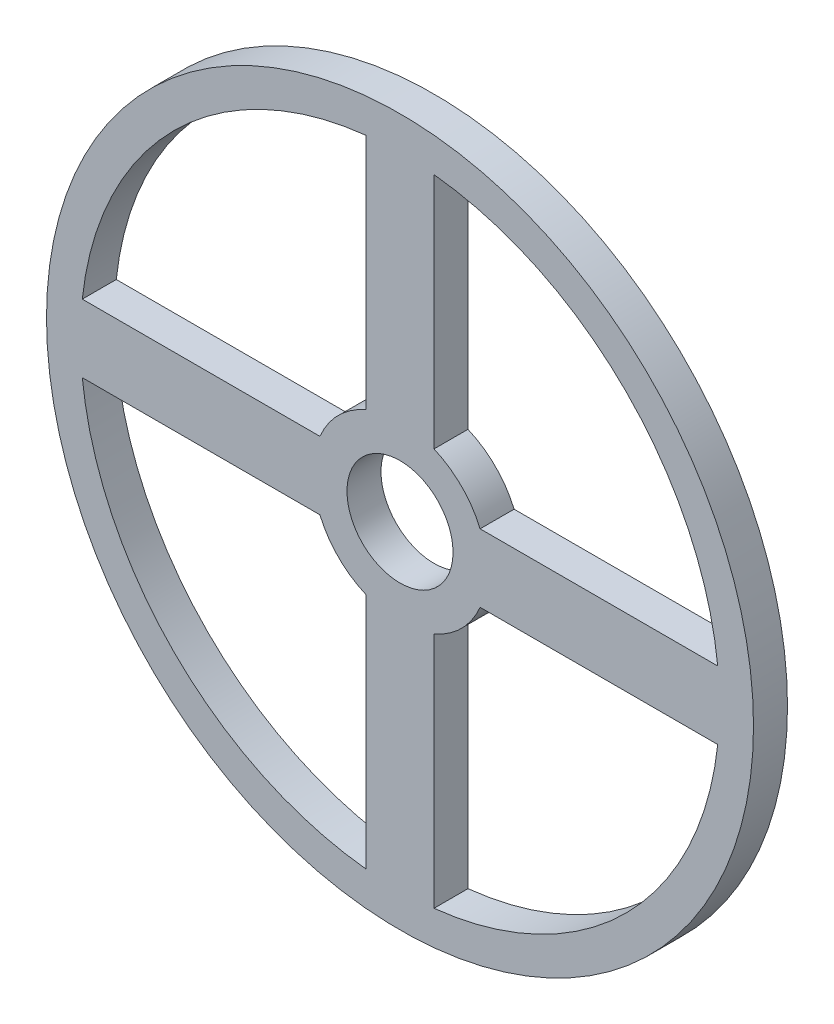
ISO-10303-21;
HEADER;
FILE_DESCRIPTION(('STEP AP214'),'2;1');
FILE_NAME('part.step','',(''),(''),'','','');
FILE_SCHEMA(('AUTOMOTIVE_DESIGN { 1 0 10303 214 1 1 1 1 }'));
ENDSEC;
DATA;
#1=APPLICATION_CONTEXT('core data for automotive mechanical design processes');
#2=APPLICATION_PROTOCOL_DEFINITION('international standard','automotive_design',2000,#1);
#3=PRODUCT_CONTEXT('',#1,'mechanical');
#4=PRODUCT('Part','Part','',(#3));
#5=PRODUCT_RELATED_PRODUCT_CATEGORY('part','',(#4));
#6=PRODUCT_DEFINITION_FORMATION('','',#4);
#7=PRODUCT_DEFINITION_CONTEXT('part definition',#1,'design');
#8=PRODUCT_DEFINITION('design','',#6,#7);
#9=PRODUCT_DEFINITION_SHAPE('','',#8);
#10=(LENGTH_UNIT() NAMED_UNIT(*) SI_UNIT(.MILLI.,.METRE.));
#11=(NAMED_UNIT(*) PLANE_ANGLE_UNIT() SI_UNIT($,.RADIAN.));
#12=(NAMED_UNIT(*) SI_UNIT($,.STERADIAN.) SOLID_ANGLE_UNIT());
#13=UNCERTAINTY_MEASURE_WITH_UNIT(LENGTH_MEASURE(1.E-05),#10,'distance_accuracy_value','');
#14=(GEOMETRIC_REPRESENTATION_CONTEXT(3) GLOBAL_UNCERTAINTY_ASSIGNED_CONTEXT((#13)) GLOBAL_UNIT_ASSIGNED_CONTEXT((#10,
#11,#12)) REPRESENTATION_CONTEXT('',''));
#15=CARTESIAN_POINT('',(0.,0.,0.));
#16=DIRECTION('',(0.,0.,1.));
#17=DIRECTION('',(1.,0.,0.));
#18=AXIS2_PLACEMENT_3D('',#15,#16,#17);
#19=CARTESIAN_POINT('',(0.,0.,3.175));
#20=DIRECTION('',(0.,0.,1.));
#21=DIRECTION('',(1.,0.,0.));
#22=AXIS2_PLACEMENT_3D('',#19,#20,#21);
#23=PLANE('',#22);
#24=DIRECTION('',(0.,1.,0.));
#25=VECTOR('',#24,1.);
#26=CARTESIAN_POINT('',(-3.175,7.48222954740095,3.175));
#27=LINE('',#26,#25);
#28=CARTESIAN_POINT('',(-3.175,7.48222954740095,3.175));
#29=VERTEX_POINT('',#28);
#30=CARTESIAN_POINT('',(-3.175,29.6756364716917,3.175));
#31=VERTEX_POINT('',#30);
#32=EDGE_CURVE('E253',#29,#31,#27,.T.);
#33=ORIENTED_EDGE('',*,*,#32,.F.);
#34=CARTESIAN_POINT('',(0.,0.,3.175));
#35=DIRECTION('',(0.,0.,-1.));
#36=DIRECTION('',(-1.,0.,0.));
#37=AXIS2_PLACEMENT_3D('',#34,#35,#36);
#38=CIRCLE('',#37,8.12800000000004);
#39=CARTESIAN_POINT('',(-7.48222954740095,3.175,3.175));
#40=VERTEX_POINT('',#39);
#41=EDGE_CURVE('E251',#40,#29,#38,.T.);
#42=ORIENTED_EDGE('',*,*,#41,.F.);
#43=DIRECTION('',(1.,0.,0.));
#44=VECTOR('',#43,1.);
#45=CARTESIAN_POINT('',(-7.48222954740095,3.175,3.175));
#46=LINE('',#45,#44);
#47=CARTESIAN_POINT('',(-29.6756364716917,3.175,3.175));
#48=VERTEX_POINT('',#47);
#49=EDGE_CURVE('E259',#48,#40,#46,.T.);
#50=ORIENTED_EDGE('',*,*,#49,.F.);
#51=CARTESIAN_POINT('',(0.,0.,3.175));
#52=DIRECTION('',(0.,0.,1.));
#53=DIRECTION('',(-1.,0.,0.));
#54=AXIS2_PLACEMENT_3D('',#51,#52,#53);
#55=CIRCLE('',#54,29.845);
#56=EDGE_CURVE('E256',#31,#48,#55,.T.);
#57=ORIENTED_EDGE('',*,*,#56,.F.);
#58=EDGE_LOOP('',(#33,#42,#50,#57));
#59=FACE_BOUND('',#58,.T.);
#60=CARTESIAN_POINT('',(0.,0.,3.175));
#61=DIRECTION('',(0.,0.,1.));
#62=DIRECTION('',(1.,0.,0.));
#63=AXIS2_PLACEMENT_3D('',#60,#61,#62);
#64=CIRCLE('',#63,33.02);
#65=CARTESIAN_POINT('',(33.02,0.,3.175));
#66=VERTEX_POINT('',#65);
#67=EDGE_CURVE('E11',#66,#66,#64,.T.);
#68=ORIENTED_EDGE('',*,*,#67,.T.);
#69=EDGE_LOOP('',(#68));
#70=FACE_BOUND('',#69,.T.);
#71=CARTESIAN_POINT('',(0.,0.,3.175));
#72=DIRECTION('',(0.,0.,1.));
#73=DIRECTION('',(1.,0.,0.));
#74=AXIS2_PLACEMENT_3D('',#71,#72,#73);
#75=CIRCLE('',#74,4.953);
#76=CARTESIAN_POINT('',(4.953,0.,3.175));
#77=VERTEX_POINT('',#76);
#78=EDGE_CURVE('E245',#77,#77,#75,.T.);
#79=ORIENTED_EDGE('',*,*,#78,.F.);
#80=EDGE_LOOP('',(#79));
#81=FACE_BOUND('',#80,.T.);
#82=DIRECTION('',(1.,0.,0.));
#83=VECTOR('',#82,1.);
#84=CARTESIAN_POINT('',(7.48222954740096,3.17499999999997,3.175));
#85=LINE('',#84,#83);
#86=CARTESIAN_POINT('',(7.48222954740096,3.17499999999997,3.175));
#87=VERTEX_POINT('',#86);
#88=CARTESIAN_POINT('',(29.6756364716917,3.17499999999989,3.175));
#89=VERTEX_POINT('',#88);
#90=EDGE_CURVE('E216',#87,#89,#85,.T.);
#91=ORIENTED_EDGE('',*,*,#90,.F.);
#92=CARTESIAN_POINT('',(0.,0.,3.175));
#93=DIRECTION('',(0.,0.,-1.));
#94=DIRECTION('',(-1.,0.,0.));
#95=AXIS2_PLACEMENT_3D('',#92,#93,#94);
#96=CIRCLE('',#95,8.12799999999999);
#97=CARTESIAN_POINT('',(3.17500000000003,7.48222954740094,3.175));
#98=VERTEX_POINT('',#97);
#99=EDGE_CURVE('E214',#98,#87,#96,.T.);
#100=ORIENTED_EDGE('',*,*,#99,.F.);
#101=DIRECTION('',(0.,-1.,0.));
#102=VECTOR('',#101,1.);
#103=CARTESIAN_POINT('',(3.17500000000003,7.48222954740094,3.175));
#104=LINE('',#103,#102);
#105=CARTESIAN_POINT('',(3.1750000000001,29.6756364716917,3.175));
#106=VERTEX_POINT('',#105);
#107=EDGE_CURVE('E222',#106,#98,#104,.T.);
#108=ORIENTED_EDGE('',*,*,#107,.F.);
#109=CARTESIAN_POINT('',(0.,0.,3.175));
#110=DIRECTION('',(0.,0.,1.));
#111=DIRECTION('',(-1.,0.,0.));
#112=AXIS2_PLACEMENT_3D('',#109,#110,#111);
#113=CIRCLE('',#112,29.845);
#114=EDGE_CURVE('E219',#89,#106,#113,.T.);
#115=ORIENTED_EDGE('',*,*,#114,.F.);
#116=EDGE_LOOP('',(#91,#100,#108,#115));
#117=FACE_BOUND('',#116,.T.);
#118=DIRECTION('',(0.,-1.,0.));
#119=VECTOR('',#118,1.);
#120=CARTESIAN_POINT('',(3.17499999999995,-7.48222954740097,3.175));
#121=LINE('',#120,#119);
#122=CARTESIAN_POINT('',(3.17499999999995,-7.48222954740097,3.175));
#123=VERTEX_POINT('',#122);
#124=CARTESIAN_POINT('',(3.1749999999998,-29.6756364716917,3.175));
#125=VERTEX_POINT('',#124);
#126=EDGE_CURVE('E185',#123,#125,#121,.T.);
#127=ORIENTED_EDGE('',*,*,#126,.F.);
#128=CARTESIAN_POINT('',(0.,0.,3.175));
#129=DIRECTION('',(0.,0.,-1.));
#130=DIRECTION('',(-1.,0.,0.));
#131=AXIS2_PLACEMENT_3D('',#128,#129,#130);
#132=CIRCLE('',#131,8.12799999999993);
#133=CARTESIAN_POINT('',(7.48222954740093,-3.17500000000005,3.175));
#134=VERTEX_POINT('',#133);
#135=EDGE_CURVE('E183',#134,#123,#132,.T.);
#136=ORIENTED_EDGE('',*,*,#135,.F.);
#137=DIRECTION('',(-1.,0.,0.));
#138=VECTOR('',#137,1.);
#139=CARTESIAN_POINT('',(7.48222954740093,-3.17500000000005,3.175));
#140=LINE('',#139,#138);
#141=CARTESIAN_POINT('',(29.6756364716917,-3.17500000000021,3.175));
#142=VERTEX_POINT('',#141);
#143=EDGE_CURVE('E191',#142,#134,#140,.T.);
#144=ORIENTED_EDGE('',*,*,#143,.F.);
#145=CARTESIAN_POINT('',(0.,0.,3.175));
#146=DIRECTION('',(0.,0.,1.));
#147=DIRECTION('',(-1.,0.,0.));
#148=AXIS2_PLACEMENT_3D('',#145,#146,#147);
#149=CIRCLE('',#148,29.845);
#150=EDGE_CURVE('E188',#125,#142,#149,.T.);
#151=ORIENTED_EDGE('',*,*,#150,.F.);
#152=EDGE_LOOP('',(#127,#136,#144,#151));
#153=FACE_BOUND('',#152,.T.);
#154=DIRECTION('',(-1.,0.,0.));
#155=VECTOR('',#154,1.);
#156=CARTESIAN_POINT('',(-7.48222954740098,-3.17499999999992,3.175));
#157=LINE('',#156,#155);
#158=CARTESIAN_POINT('',(-7.48222954740098,-3.17499999999992,3.175));
#159=VERTEX_POINT('',#158);
#160=CARTESIAN_POINT('',(-29.6756364716918,-3.17499999999969,3.175));
#161=VERTEX_POINT('',#160);
#162=EDGE_CURVE('E155',#159,#161,#157,.T.);
#163=ORIENTED_EDGE('',*,*,#162,.F.);
#164=CARTESIAN_POINT('',(0.,0.,3.175));
#165=DIRECTION('',(0.,0.,-1.));
#166=DIRECTION('',(-1.,0.,0.));
#167=AXIS2_PLACEMENT_3D('',#164,#165,#166);
#168=CIRCLE('',#167,8.12799999999999);
#169=CARTESIAN_POINT('',(-3.17500000000008,-7.48222954740092,3.175));
#170=VERTEX_POINT('',#169);
#171=EDGE_CURVE('E147',#170,#159,#168,.T.);
#172=ORIENTED_EDGE('',*,*,#171,.F.);
#173=DIRECTION('',(0.,1.,0.));
#174=VECTOR('',#173,1.);
#175=CARTESIAN_POINT('',(-3.17500000000008,-7.48222954740092,3.175));
#176=LINE('',#175,#174);
#177=CARTESIAN_POINT('',(-3.17500000000031,-29.6756364716917,3.175));
#178=VERTEX_POINT('',#177);
#179=EDGE_CURVE('E169',#178,#170,#176,.T.);
#180=ORIENTED_EDGE('',*,*,#179,.F.);
#181=CARTESIAN_POINT('',(0.,0.,3.175));
#182=DIRECTION('',(0.,0.,1.));
#183=DIRECTION('',(-1.,0.,0.));
#184=AXIS2_PLACEMENT_3D('',#181,#182,#183);
#185=CIRCLE('',#184,29.845);
#186=EDGE_CURVE('E167',#161,#178,#185,.T.);
#187=ORIENTED_EDGE('',*,*,#186,.F.);
#188=EDGE_LOOP('',(#163,#172,#180,#187));
#189=FACE_BOUND('',#188,.T.);
#190=ADVANCED_FACE('F34',(#59,#70,#81,#117,#153,#189),#23,.T.);
#191=CARTESIAN_POINT('',(0.,0.,0.));
#192=DIRECTION('',(0.,0.,1.));
#193=DIRECTION('',(1.,0.,0.));
#194=AXIS2_PLACEMENT_3D('',#191,#192,#193);
#195=PLANE('',#194);
#196=CARTESIAN_POINT('',(0.,0.,0.));
#197=DIRECTION('',(0.,0.,-1.));
#198=DIRECTION('',(-1.,0.,0.));
#199=AXIS2_PLACEMENT_3D('',#196,#197,#198);
#200=CIRCLE('',#199,8.12799999999993);
#201=CARTESIAN_POINT('',(7.48222954740093,-3.17500000000005,0.));
#202=VERTEX_POINT('',#201);
#203=CARTESIAN_POINT('',(3.17499999999995,-7.48222954740097,0.));
#204=VERTEX_POINT('',#203);
#205=EDGE_CURVE('E163',#202,#204,#200,.T.);
#206=ORIENTED_EDGE('',*,*,#205,.T.);
#207=DIRECTION('',(0.,-1.,0.));
#208=VECTOR('',#207,1.);
#209=CARTESIAN_POINT('',(3.17499999999995,-7.48222954740097,0.));
#210=LINE('',#209,#208);
#211=CARTESIAN_POINT('',(3.1749999999998,-29.6756364716917,0.));
#212=VERTEX_POINT('',#211);
#213=EDGE_CURVE('E196',#204,#212,#210,.T.);
#214=ORIENTED_EDGE('',*,*,#213,.T.);
#215=CARTESIAN_POINT('',(0.,0.,0.));
#216=DIRECTION('',(0.,0.,1.));
#217=DIRECTION('',(-1.,0.,0.));
#218=AXIS2_PLACEMENT_3D('',#215,#216,#217);
#219=CIRCLE('',#218,29.845);
#220=CARTESIAN_POINT('',(29.6756364716917,-3.17500000000021,0.));
#221=VERTEX_POINT('',#220);
#222=EDGE_CURVE('E199',#212,#221,#219,.T.);
#223=ORIENTED_EDGE('',*,*,#222,.T.);
#224=DIRECTION('',(-1.,0.,0.));
#225=VECTOR('',#224,1.);
#226=CARTESIAN_POINT('',(7.48222954740093,-3.17500000000005,0.));
#227=LINE('',#226,#225);
#228=EDGE_CURVE('E186',#221,#202,#227,.T.);
#229=ORIENTED_EDGE('',*,*,#228,.T.);
#230=EDGE_LOOP('',(#206,#214,#223,#229));
#231=FACE_BOUND('',#230,.T.);
#232=CARTESIAN_POINT('',(0.,0.,0.));
#233=DIRECTION('',(0.,0.,1.));
#234=DIRECTION('',(1.,0.,0.));
#235=AXIS2_PLACEMENT_3D('',#232,#233,#234);
#236=CIRCLE('',#235,4.953);
#237=CARTESIAN_POINT('',(4.953,0.,0.));
#238=VERTEX_POINT('',#237);
#239=EDGE_CURVE('E244',#238,#238,#236,.T.);
#240=ORIENTED_EDGE('',*,*,#239,.T.);
#241=EDGE_LOOP('',(#240));
#242=FACE_BOUND('',#241,.T.);
#243=CARTESIAN_POINT('',(0.,0.,0.));
#244=DIRECTION('',(0.,0.,-1.));
#245=DIRECTION('',(-1.,0.,0.));
#246=AXIS2_PLACEMENT_3D('',#243,#244,#245);
#247=CIRCLE('',#246,8.12800000000004);
#248=CARTESIAN_POINT('',(-7.48222954740095,3.175,0.));
#249=VERTEX_POINT('',#248);
#250=CARTESIAN_POINT('',(-3.175,7.48222954740095,0.));
#251=VERTEX_POINT('',#250);
#252=EDGE_CURVE('E248',#249,#251,#247,.T.);
#253=ORIENTED_EDGE('',*,*,#252,.T.);
#254=DIRECTION('',(0.,1.,0.));
#255=VECTOR('',#254,1.);
#256=CARTESIAN_POINT('',(-3.175,7.48222954740095,0.));
#257=LINE('',#256,#255);
#258=CARTESIAN_POINT('',(-3.175,29.6756364716917,0.));
#259=VERTEX_POINT('',#258);
#260=EDGE_CURVE('E264',#251,#259,#257,.T.);
#261=ORIENTED_EDGE('',*,*,#260,.T.);
#262=CARTESIAN_POINT('',(0.,0.,0.));
#263=DIRECTION('',(0.,0.,1.));
#264=DIRECTION('',(-1.,0.,0.));
#265=AXIS2_PLACEMENT_3D('',#262,#263,#264);
#266=CIRCLE('',#265,29.845);
#267=CARTESIAN_POINT('',(-29.6756364716917,3.175,0.));
#268=VERTEX_POINT('',#267);
#269=EDGE_CURVE('E267',#259,#268,#266,.T.);
#270=ORIENTED_EDGE('',*,*,#269,.T.);
#271=DIRECTION('',(1.,0.,0.));
#272=VECTOR('',#271,1.);
#273=CARTESIAN_POINT('',(-7.48222954740095,3.175,0.));
#274=LINE('',#273,#272);
#275=EDGE_CURVE('E254',#268,#249,#274,.T.);
#276=ORIENTED_EDGE('',*,*,#275,.T.);
#277=EDGE_LOOP('',(#253,#261,#270,#276));
#278=FACE_BOUND('',#277,.T.);
#279=CARTESIAN_POINT('',(0.,0.,0.));
#280=DIRECTION('',(0.,0.,1.));
#281=DIRECTION('',(1.,0.,0.));
#282=AXIS2_PLACEMENT_3D('',#279,#280,#281);
#283=CIRCLE('',#282,33.02);
#284=CARTESIAN_POINT('',(33.02,0.,0.));
#285=VERTEX_POINT('',#284);
#286=EDGE_CURVE('E38',#285,#285,#283,.T.);
#287=ORIENTED_EDGE('',*,*,#286,.F.);
#288=EDGE_LOOP('',(#287));
#289=FACE_BOUND('',#288,.T.);
#290=CARTESIAN_POINT('',(0.,0.,0.));
#291=DIRECTION('',(0.,0.,-1.));
#292=DIRECTION('',(-1.,0.,0.));
#293=AXIS2_PLACEMENT_3D('',#290,#291,#292);
#294=CIRCLE('',#293,8.12799999999999);
#295=CARTESIAN_POINT('',(3.17500000000003,7.48222954740094,0.));
#296=VERTEX_POINT('',#295);
#297=CARTESIAN_POINT('',(7.48222954740096,3.17499999999997,0.));
#298=VERTEX_POINT('',#297);
#299=EDGE_CURVE('E213',#296,#298,#294,.T.);
#300=ORIENTED_EDGE('',*,*,#299,.T.);
#301=DIRECTION('',(1.,0.,0.));
#302=VECTOR('',#301,1.);
#303=CARTESIAN_POINT('',(7.48222954740096,3.17499999999997,0.));
#304=LINE('',#303,#302);
#305=CARTESIAN_POINT('',(29.6756364716917,3.17499999999989,0.));
#306=VERTEX_POINT('',#305);
#307=EDGE_CURVE('E227',#298,#306,#304,.T.);
#308=ORIENTED_EDGE('',*,*,#307,.T.);
#309=CARTESIAN_POINT('',(0.,0.,0.));
#310=DIRECTION('',(0.,0.,1.));
#311=DIRECTION('',(-1.,0.,0.));
#312=AXIS2_PLACEMENT_3D('',#309,#310,#311);
#313=CIRCLE('',#312,29.845);
#314=CARTESIAN_POINT('',(3.1750000000001,29.6756364716917,0.));
#315=VERTEX_POINT('',#314);
#316=EDGE_CURVE('E230',#306,#315,#313,.T.);
#317=ORIENTED_EDGE('',*,*,#316,.T.);
#318=DIRECTION('',(0.,-1.,0.));
#319=VECTOR('',#318,1.);
#320=CARTESIAN_POINT('',(3.17500000000003,7.48222954740094,0.));
#321=LINE('',#320,#319);
#322=EDGE_CURVE('E217',#315,#296,#321,.T.);
#323=ORIENTED_EDGE('',*,*,#322,.T.);
#324=EDGE_LOOP('',(#300,#308,#317,#323));
#325=FACE_BOUND('',#324,.T.);
#326=CARTESIAN_POINT('',(0.,0.,0.));
#327=DIRECTION('',(0.,0.,-1.));
#328=DIRECTION('',(-1.,0.,0.));
#329=AXIS2_PLACEMENT_3D('',#326,#327,#328);
#330=CIRCLE('',#329,8.12799999999999);
#331=CARTESIAN_POINT('',(-3.17500000000008,-7.48222954740092,0.));
#332=VERTEX_POINT('',#331);
#333=CARTESIAN_POINT('',(-7.48222954740098,-3.17499999999992,0.));
#334=VERTEX_POINT('',#333);
#335=EDGE_CURVE('E57',#332,#334,#330,.T.);
#336=ORIENTED_EDGE('',*,*,#335,.T.);
#337=DIRECTION('',(-1.,0.,0.));
#338=VECTOR('',#337,1.);
#339=CARTESIAN_POINT('',(-7.48222954740098,-3.17499999999992,0.));
#340=LINE('',#339,#338);
#341=CARTESIAN_POINT('',(-29.6756364716918,-3.17499999999969,0.));
#342=VERTEX_POINT('',#341);
#343=EDGE_CURVE('E162',#334,#342,#340,.T.);
#344=ORIENTED_EDGE('',*,*,#343,.T.);
#345=CARTESIAN_POINT('',(0.,0.,0.));
#346=DIRECTION('',(0.,0.,1.));
#347=DIRECTION('',(-1.,0.,0.));
#348=AXIS2_PLACEMENT_3D('',#345,#346,#347);
#349=CIRCLE('',#348,29.845);
#350=CARTESIAN_POINT('',(-3.17500000000031,-29.6756364716917,0.));
#351=VERTEX_POINT('',#350);
#352=EDGE_CURVE('E175',#342,#351,#349,.T.);
#353=ORIENTED_EDGE('',*,*,#352,.T.);
#354=DIRECTION('',(0.,1.,0.));
#355=VECTOR('',#354,1.);
#356=CARTESIAN_POINT('',(-3.17500000000008,-7.48222954740092,0.));
#357=LINE('',#356,#355);
#358=EDGE_CURVE('E156',#351,#332,#357,.T.);
#359=ORIENTED_EDGE('',*,*,#358,.T.);
#360=EDGE_LOOP('',(#336,#344,#353,#359));
#361=FACE_BOUND('',#360,.T.);
#362=ADVANCED_FACE('F286',(#231,#242,#278,#289,#325,#361),#195,.F.);
#363=CARTESIAN_POINT('',(0.,0.,3.175));
#364=DIRECTION('',(0.,0.,-1.));
#365=DIRECTION('',(-1.,0.,0.));
#366=AXIS2_PLACEMENT_3D('',#363,#364,#365);
#367=CYLINDRICAL_SURFACE('',#366,33.02);
#368=ORIENTED_EDGE('',*,*,#67,.F.);
#369=EDGE_LOOP('',(#368));
#370=FACE_BOUND('',#369,.T.);
#371=ORIENTED_EDGE('',*,*,#286,.T.);
#372=EDGE_LOOP('',(#371));
#373=FACE_BOUND('',#372,.T.);
#374=ADVANCED_FACE('F36',(#370,#373),#367,.T.);
#375=CARTESIAN_POINT('',(0.,0.,3.175));
#376=DIRECTION('',(0.,0.,-1.));
#377=DIRECTION('',(-1.,0.,0.));
#378=AXIS2_PLACEMENT_3D('',#375,#376,#377);
#379=CYLINDRICAL_SURFACE('',#378,8.12800000000004);
#380=ORIENTED_EDGE('',*,*,#252,.F.);
#381=DIRECTION('',(0.,0.,-1.));
#382=VECTOR('',#381,1.);
#383=CARTESIAN_POINT('',(-7.48222954740095,3.175,3.175));
#384=LINE('',#383,#382);
#385=EDGE_CURVE('E261',#40,#249,#384,.T.);
#386=ORIENTED_EDGE('',*,*,#385,.F.);
#387=ORIENTED_EDGE('',*,*,#41,.T.);
#388=DIRECTION('',(0.,0.,-1.));
#389=VECTOR('',#388,1.);
#390=CARTESIAN_POINT('',(-3.175,7.48222954740095,3.175));
#391=LINE('',#390,#389);
#392=EDGE_CURVE('E278',#29,#251,#391,.T.);
#393=ORIENTED_EDGE('',*,*,#392,.T.);
#394=EDGE_LOOP('',(#380,#386,#387,#393));
#395=FACE_BOUND('',#394,.T.);
#396=ADVANCED_FACE('F309',(#395),#379,.T.);
#397=CARTESIAN_POINT('',(-3.175,7.48222954740095,3.175));
#398=DIRECTION('',(-1.,0.,0.));
#399=DIRECTION('',(0.,0.,1.));
#400=AXIS2_PLACEMENT_3D('',#397,#398,#399);
#401=PLANE('',#400);
#402=ORIENTED_EDGE('',*,*,#260,.F.);
#403=ORIENTED_EDGE('',*,*,#392,.F.);
#404=ORIENTED_EDGE('',*,*,#32,.T.);
#405=DIRECTION('',(0.,0.,-1.));
#406=VECTOR('',#405,1.);
#407=CARTESIAN_POINT('',(-3.175,29.6756364716917,3.175));
#408=LINE('',#407,#406);
#409=EDGE_CURVE('E276',#31,#259,#408,.T.);
#410=ORIENTED_EDGE('',*,*,#409,.T.);
#411=EDGE_LOOP('',(#402,#403,#404,#410));
#412=FACE_BOUND('',#411,.T.);
#413=ADVANCED_FACE('F312',(#412),#401,.T.);
#414=CARTESIAN_POINT('',(0.,0.,3.175));
#415=DIRECTION('',(0.,0.,-1.));
#416=DIRECTION('',(-1.,0.,0.));
#417=AXIS2_PLACEMENT_3D('',#414,#415,#416);
#418=CYLINDRICAL_SURFACE('',#417,29.845);
#419=ORIENTED_EDGE('',*,*,#269,.F.);
#420=ORIENTED_EDGE('',*,*,#409,.F.);
#421=ORIENTED_EDGE('',*,*,#56,.T.);
#422=DIRECTION('',(0.,0.,-1.));
#423=VECTOR('',#422,1.);
#424=CARTESIAN_POINT('',(-29.6756364716917,3.175,3.175));
#425=LINE('',#424,#423);
#426=EDGE_CURVE('E274',#48,#268,#425,.T.);
#427=ORIENTED_EDGE('',*,*,#426,.T.);
#428=EDGE_LOOP('',(#419,#420,#421,#427));
#429=FACE_BOUND('',#428,.T.);
#430=ADVANCED_FACE('F315',(#429),#418,.F.);
#431=CARTESIAN_POINT('',(-7.48222954740095,3.175,3.175));
#432=DIRECTION('',(0.,1.,0.));
#433=DIRECTION('',(0.,0.,1.));
#434=AXIS2_PLACEMENT_3D('',#431,#432,#433);
#435=PLANE('',#434);
#436=ORIENTED_EDGE('',*,*,#275,.F.);
#437=ORIENTED_EDGE('',*,*,#426,.F.);
#438=ORIENTED_EDGE('',*,*,#49,.T.);
#439=ORIENTED_EDGE('',*,*,#385,.T.);
#440=EDGE_LOOP('',(#436,#437,#438,#439));
#441=FACE_BOUND('',#440,.T.);
#442=ADVANCED_FACE('F319',(#441),#435,.T.);
#443=CARTESIAN_POINT('',(0.,0.,3.175));
#444=DIRECTION('',(0.,0.,-1.));
#445=DIRECTION('',(-1.,0.,0.));
#446=AXIS2_PLACEMENT_3D('',#443,#444,#445);
#447=CYLINDRICAL_SURFACE('',#446,4.953);
#448=ORIENTED_EDGE('',*,*,#78,.T.);
#449=EDGE_LOOP('',(#448));
#450=FACE_BOUND('',#449,.T.);
#451=ORIENTED_EDGE('',*,*,#239,.F.);
#452=EDGE_LOOP('',(#451));
#453=FACE_BOUND('',#452,.T.);
#454=ADVANCED_FACE('F323',(#450,#453),#447,.F.);
#455=CARTESIAN_POINT('',(0.,0.,3.175));
#456=DIRECTION('',(0.,0.,-1.));
#457=DIRECTION('',(-1.,0.,0.));
#458=AXIS2_PLACEMENT_3D('',#455,#456,#457);
#459=CYLINDRICAL_SURFACE('',#458,8.12799999999999);
#460=ORIENTED_EDGE('',*,*,#299,.F.);
#461=DIRECTION('',(0.,0.,-1.));
#462=VECTOR('',#461,1.);
#463=CARTESIAN_POINT('',(3.17500000000003,7.48222954740094,3.175));
#464=LINE('',#463,#462);
#465=EDGE_CURVE('E224',#98,#296,#464,.T.);
#466=ORIENTED_EDGE('',*,*,#465,.F.);
#467=ORIENTED_EDGE('',*,*,#99,.T.);
#468=DIRECTION('',(0.,0.,-1.));
#469=VECTOR('',#468,1.);
#470=CARTESIAN_POINT('',(7.48222954740096,3.17499999999997,3.175));
#471=LINE('',#470,#469);
#472=EDGE_CURVE('E241',#87,#298,#471,.T.);
#473=ORIENTED_EDGE('',*,*,#472,.T.);
#474=EDGE_LOOP('',(#460,#466,#467,#473));
#475=FACE_BOUND('',#474,.T.);
#476=ADVANCED_FACE('F327',(#475),#459,.T.);
#477=CARTESIAN_POINT('',(7.48222954740096,3.17499999999997,3.175));
#478=DIRECTION('',(0.,1.,0.));
#479=DIRECTION('',(-1.,0.,0.));
#480=AXIS2_PLACEMENT_3D('',#477,#478,#479);
#481=PLANE('',#480);
#482=ORIENTED_EDGE('',*,*,#307,.F.);
#483=ORIENTED_EDGE('',*,*,#472,.F.);
#484=ORIENTED_EDGE('',*,*,#90,.T.);
#485=DIRECTION('',(0.,0.,-1.));
#486=VECTOR('',#485,1.);
#487=CARTESIAN_POINT('',(29.6756364716917,3.17499999999989,3.175));
#488=LINE('',#487,#486);
#489=EDGE_CURVE('E239',#89,#306,#488,.T.);
#490=ORIENTED_EDGE('',*,*,#489,.T.);
#491=EDGE_LOOP('',(#482,#483,#484,#490));
#492=FACE_BOUND('',#491,.T.);
#493=ADVANCED_FACE('F331',(#492),#481,.T.);
#494=CARTESIAN_POINT('',(0.,0.,3.175));
#495=DIRECTION('',(0.,0.,-1.));
#496=DIRECTION('',(-1.,0.,0.));
#497=AXIS2_PLACEMENT_3D('',#494,#495,#496);
#498=CYLINDRICAL_SURFACE('',#497,29.845);
#499=ORIENTED_EDGE('',*,*,#316,.F.);
#500=ORIENTED_EDGE('',*,*,#489,.F.);
#501=ORIENTED_EDGE('',*,*,#114,.T.);
#502=DIRECTION('',(0.,0.,-1.));
#503=VECTOR('',#502,1.);
#504=CARTESIAN_POINT('',(3.1750000000001,29.6756364716917,3.175));
#505=LINE('',#504,#503);
#506=EDGE_CURVE('E237',#106,#315,#505,.T.);
#507=ORIENTED_EDGE('',*,*,#506,.T.);
#508=EDGE_LOOP('',(#499,#500,#501,#507));
#509=FACE_BOUND('',#508,.T.);
#510=ADVANCED_FACE('F335',(#509),#498,.F.);
#511=CARTESIAN_POINT('',(3.17500000000003,7.48222954740094,3.175));
#512=DIRECTION('',(1.,0.,0.));
#513=DIRECTION('',(0.,1.,0.));
#514=AXIS2_PLACEMENT_3D('',#511,#512,#513);
#515=PLANE('',#514);
#516=ORIENTED_EDGE('',*,*,#322,.F.);
#517=ORIENTED_EDGE('',*,*,#506,.F.);
#518=ORIENTED_EDGE('',*,*,#107,.T.);
#519=ORIENTED_EDGE('',*,*,#465,.T.);
#520=EDGE_LOOP('',(#516,#517,#518,#519));
#521=FACE_BOUND('',#520,.T.);
#522=ADVANCED_FACE('F339',(#521),#515,.T.);
#523=CARTESIAN_POINT('',(0.,0.,3.175));
#524=DIRECTION('',(0.,0.,-1.));
#525=DIRECTION('',(-1.,0.,0.));
#526=AXIS2_PLACEMENT_3D('',#523,#524,#525);
#527=CYLINDRICAL_SURFACE('',#526,8.12799999999993);
#528=ORIENTED_EDGE('',*,*,#205,.F.);
#529=DIRECTION('',(0.,0.,-1.));
#530=VECTOR('',#529,1.);
#531=CARTESIAN_POINT('',(7.48222954740093,-3.17500000000005,3.175));
#532=LINE('',#531,#530);
#533=EDGE_CURVE('E193',#134,#202,#532,.T.);
#534=ORIENTED_EDGE('',*,*,#533,.F.);
#535=ORIENTED_EDGE('',*,*,#135,.T.);
#536=DIRECTION('',(0.,0.,-1.));
#537=VECTOR('',#536,1.);
#538=CARTESIAN_POINT('',(3.17499999999995,-7.48222954740097,3.175));
#539=LINE('',#538,#537);
#540=EDGE_CURVE('E210',#123,#204,#539,.T.);
#541=ORIENTED_EDGE('',*,*,#540,.T.);
#542=EDGE_LOOP('',(#528,#534,#535,#541));
#543=FACE_BOUND('',#542,.T.);
#544=ADVANCED_FACE('F343',(#543),#527,.T.);
#545=CARTESIAN_POINT('',(3.17499999999995,-7.48222954740097,3.175));
#546=DIRECTION('',(1.,0.,0.));
#547=DIRECTION('',(0.,1.,0.));
#548=AXIS2_PLACEMENT_3D('',#545,#546,#547);
#549=PLANE('',#548);
#550=ORIENTED_EDGE('',*,*,#213,.F.);
#551=ORIENTED_EDGE('',*,*,#540,.F.);
#552=ORIENTED_EDGE('',*,*,#126,.T.);
#553=DIRECTION('',(0.,0.,-1.));
#554=VECTOR('',#553,1.);
#555=CARTESIAN_POINT('',(3.1749999999998,-29.6756364716917,3.175));
#556=LINE('',#555,#554);
#557=EDGE_CURVE('E208',#125,#212,#556,.T.);
#558=ORIENTED_EDGE('',*,*,#557,.T.);
#559=EDGE_LOOP('',(#550,#551,#552,#558));
#560=FACE_BOUND('',#559,.T.);
#561=ADVANCED_FACE('F347',(#560),#549,.T.);
#562=CARTESIAN_POINT('',(0.,0.,3.175));
#563=DIRECTION('',(0.,0.,-1.));
#564=DIRECTION('',(-1.,0.,0.));
#565=AXIS2_PLACEMENT_3D('',#562,#563,#564);
#566=CYLINDRICAL_SURFACE('',#565,29.845);
#567=ORIENTED_EDGE('',*,*,#222,.F.);
#568=ORIENTED_EDGE('',*,*,#557,.F.);
#569=ORIENTED_EDGE('',*,*,#150,.T.);
#570=DIRECTION('',(0.,0.,-1.));
#571=VECTOR('',#570,1.);
#572=CARTESIAN_POINT('',(29.6756364716917,-3.17500000000021,3.175));
#573=LINE('',#572,#571);
#574=EDGE_CURVE('E206',#142,#221,#573,.T.);
#575=ORIENTED_EDGE('',*,*,#574,.T.);
#576=EDGE_LOOP('',(#567,#568,#569,#575));
#577=FACE_BOUND('',#576,.T.);
#578=ADVANCED_FACE('F351',(#577),#566,.F.);
#579=CARTESIAN_POINT('',(7.48222954740093,-3.17500000000005,3.175));
#580=DIRECTION('',(0.,-1.,0.));
#581=DIRECTION('',(1.,0.,0.));
#582=AXIS2_PLACEMENT_3D('',#579,#580,#581);
#583=PLANE('',#582);
#584=ORIENTED_EDGE('',*,*,#228,.F.);
#585=ORIENTED_EDGE('',*,*,#574,.F.);
#586=ORIENTED_EDGE('',*,*,#143,.T.);
#587=ORIENTED_EDGE('',*,*,#533,.T.);
#588=EDGE_LOOP('',(#584,#585,#586,#587));
#589=FACE_BOUND('',#588,.T.);
#590=ADVANCED_FACE('F355',(#589),#583,.T.);
#591=CARTESIAN_POINT('',(0.,0.,3.175));
#592=DIRECTION('',(0.,0.,-1.));
#593=DIRECTION('',(-1.,0.,0.));
#594=AXIS2_PLACEMENT_3D('',#591,#592,#593);
#595=CYLINDRICAL_SURFACE('',#594,8.12799999999999);
#596=ORIENTED_EDGE('',*,*,#335,.F.);
#597=DIRECTION('',(0.,0.,-1.));
#598=VECTOR('',#597,1.);
#599=CARTESIAN_POINT('',(-3.17500000000008,-7.48222954740092,3.175));
#600=LINE('',#599,#598);
#601=EDGE_CURVE('E151',#170,#332,#600,.T.);
#602=ORIENTED_EDGE('',*,*,#601,.F.);
#603=ORIENTED_EDGE('',*,*,#171,.T.);
#604=DIRECTION('',(0.,0.,-1.));
#605=VECTOR('',#604,1.);
#606=CARTESIAN_POINT('',(-7.48222954740098,-3.17499999999992,3.175));
#607=LINE('',#606,#605);
#608=EDGE_CURVE('E150',#159,#334,#607,.T.);
#609=ORIENTED_EDGE('',*,*,#608,.T.);
#610=EDGE_LOOP('',(#596,#602,#603,#609));
#611=FACE_BOUND('',#610,.T.);
#612=ADVANCED_FACE('F149',(#611),#595,.T.);
#613=CARTESIAN_POINT('',(-7.48222954740098,-3.17499999999992,3.175));
#614=DIRECTION('',(0.,-1.,0.));
#615=DIRECTION('',(1.,0.,0.));
#616=AXIS2_PLACEMENT_3D('',#613,#614,#615);
#617=PLANE('',#616);
#618=ORIENTED_EDGE('',*,*,#343,.F.);
#619=ORIENTED_EDGE('',*,*,#608,.F.);
#620=ORIENTED_EDGE('',*,*,#162,.T.);
#621=DIRECTION('',(0.,0.,-1.));
#622=VECTOR('',#621,1.);
#623=CARTESIAN_POINT('',(-29.6756364716918,-3.17499999999969,3.175));
#624=LINE('',#623,#622);
#625=EDGE_CURVE('E164',#161,#342,#624,.T.);
#626=ORIENTED_EDGE('',*,*,#625,.T.);
#627=EDGE_LOOP('',(#618,#619,#620,#626));
#628=FACE_BOUND('',#627,.T.);
#629=ADVANCED_FACE('F159',(#628),#617,.T.);
#630=CARTESIAN_POINT('',(0.,0.,3.175));
#631=DIRECTION('',(0.,0.,-1.));
#632=DIRECTION('',(-1.,0.,0.));
#633=AXIS2_PLACEMENT_3D('',#630,#631,#632);
#634=CYLINDRICAL_SURFACE('',#633,29.845);
#635=ORIENTED_EDGE('',*,*,#352,.F.);
#636=ORIENTED_EDGE('',*,*,#625,.F.);
#637=ORIENTED_EDGE('',*,*,#186,.T.);
#638=DIRECTION('',(0.,0.,-1.));
#639=VECTOR('',#638,1.);
#640=CARTESIAN_POINT('',(-3.17500000000031,-29.6756364716917,3.175));
#641=LINE('',#640,#639);
#642=EDGE_CURVE('E49',#178,#351,#641,.T.);
#643=ORIENTED_EDGE('',*,*,#642,.T.);
#644=EDGE_LOOP('',(#635,#636,#637,#643));
#645=FACE_BOUND('',#644,.T.);
#646=ADVANCED_FACE('F294',(#645),#634,.F.);
#647=CARTESIAN_POINT('',(-3.17500000000008,-7.48222954740092,3.175));
#648=DIRECTION('',(-1.,0.,0.));
#649=DIRECTION('',(0.,-1.,0.));
#650=AXIS2_PLACEMENT_3D('',#647,#648,#649);
#651=PLANE('',#650);
#652=ORIENTED_EDGE('',*,*,#358,.F.);
#653=ORIENTED_EDGE('',*,*,#642,.F.);
#654=ORIENTED_EDGE('',*,*,#179,.T.);
#655=ORIENTED_EDGE('',*,*,#601,.T.);
#656=EDGE_LOOP('',(#652,#653,#654,#655));
#657=FACE_BOUND('',#656,.T.);
#658=ADVANCED_FACE('F292',(#657),#651,.T.);
#659=CLOSED_SHELL('',(#190,#362,#374,#396,#413,#430,#442,#454,#476,#493,#510,#522,#544,#561,
#578,#590,#612,#629,#646,#658));
#660=MANIFOLD_SOLID_BREP('B2',#659);
#661=ADVANCED_BREP_SHAPE_REPRESENTATION('',(#18,#660),#14);
#662=SHAPE_DEFINITION_REPRESENTATION(#9,#661);
ENDSEC;
END-ISO-10303-21;
